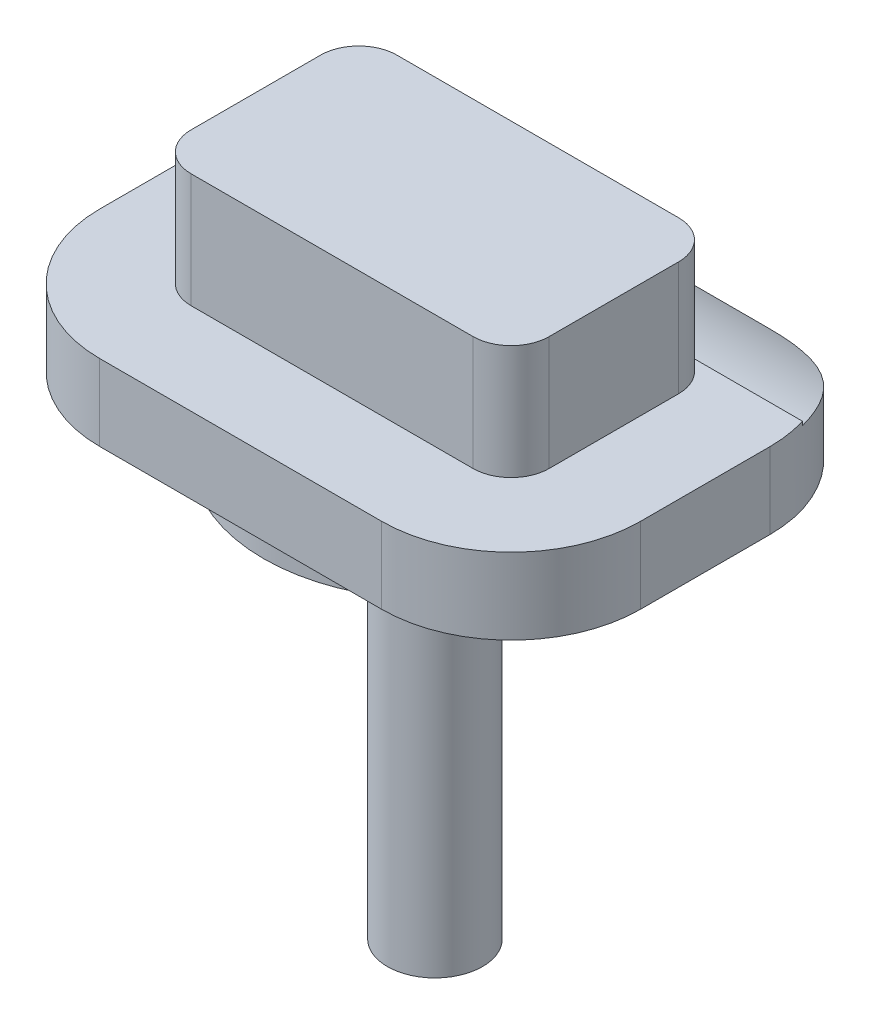
ISO-10303-21;
HEADER;
FILE_DESCRIPTION(('STEP AP214'),'2;1');
FILE_NAME('part.step','',(''),(''),'','','');
FILE_SCHEMA(('AUTOMOTIVE_DESIGN { 1 0 10303 214 1 1 1 1 }'));
ENDSEC;
DATA;
#1=APPLICATION_CONTEXT('core data for automotive mechanical design processes');
#2=APPLICATION_PROTOCOL_DEFINITION('international standard','automotive_design',2000,#1);
#3=PRODUCT_CONTEXT('',#1,'mechanical');
#4=PRODUCT('Part','Part','',(#3));
#5=PRODUCT_RELATED_PRODUCT_CATEGORY('part','',(#4));
#6=PRODUCT_DEFINITION_FORMATION('','',#4);
#7=PRODUCT_DEFINITION_CONTEXT('part definition',#1,'design');
#8=PRODUCT_DEFINITION('design','',#6,#7);
#9=PRODUCT_DEFINITION_SHAPE('','',#8);
#10=(LENGTH_UNIT() NAMED_UNIT(*) SI_UNIT(.MILLI.,.METRE.));
#11=(NAMED_UNIT(*) PLANE_ANGLE_UNIT() SI_UNIT($,.RADIAN.));
#12=(NAMED_UNIT(*) SI_UNIT($,.STERADIAN.) SOLID_ANGLE_UNIT());
#13=UNCERTAINTY_MEASURE_WITH_UNIT(LENGTH_MEASURE(1.E-05),#10,'distance_accuracy_value','');
#14=(GEOMETRIC_REPRESENTATION_CONTEXT(3) GLOBAL_UNCERTAINTY_ASSIGNED_CONTEXT((#13)) GLOBAL_UNIT_ASSIGNED_CONTEXT((#10,
#11,#12)) REPRESENTATION_CONTEXT('',''));
#15=CARTESIAN_POINT('',(0.,0.,0.));
#16=DIRECTION('',(0.,0.,1.));
#17=DIRECTION('',(1.,0.,0.));
#18=AXIS2_PLACEMENT_3D('',#15,#16,#17);
#19=CARTESIAN_POINT('',(1.,-2.,-1.));
#20=DIRECTION('',(0.,-1.,0.));
#21=DIRECTION('',(0.,0.,-1.));
#22=AXIS2_PLACEMENT_3D('',#19,#20,#21);
#23=PLANE('',#22);
#24=CARTESIAN_POINT('',(1.,-2.,-1.));
#25=DIRECTION('',(0.,-1.,0.));
#26=DIRECTION('',(0.,0.,-1.));
#27=AXIS2_PLACEMENT_3D('',#24,#25,#26);
#28=CIRCLE('',#27,3.4);
#29=CARTESIAN_POINT('',(1.,-2.,2.4));
#30=VERTEX_POINT('',#29);
#31=CARTESIAN_POINT('',(-2.4,-2.,-1.));
#32=VERTEX_POINT('',#31);
#33=EDGE_CURVE('E229',#30,#32,#28,.T.);
#34=ORIENTED_EDGE('',*,*,#33,.T.);
#35=DIRECTION('',(0.,0.,-1.));
#36=VECTOR('',#35,1.);
#37=CARTESIAN_POINT('',(-2.4,-2.,-4.4));
#38=LINE('',#37,#36);
#39=CARTESIAN_POINT('',(-2.4,-2.,-4.4));
#40=VERTEX_POINT('',#39);
#41=EDGE_CURVE('E398',#32,#40,#38,.T.);
#42=ORIENTED_EDGE('',*,*,#41,.T.);
#43=CARTESIAN_POINT('',(1.,-2.,-4.4));
#44=DIRECTION('',(0.,-1.,0.));
#45=DIRECTION('',(0.,0.,1.));
#46=AXIS2_PLACEMENT_3D('',#43,#44,#45);
#47=CIRCLE('',#46,3.4);
#48=CARTESIAN_POINT('',(1.,-2.,-7.8));
#49=VERTEX_POINT('',#48);
#50=EDGE_CURVE('E397',#40,#49,#47,.T.);
#51=ORIENTED_EDGE('',*,*,#50,.T.);
#52=DIRECTION('',(1.,0.,0.));
#53=VECTOR('',#52,1.);
#54=CARTESIAN_POINT('',(1.,-2.,-7.8));
#55=LINE('',#54,#53);
#56=CARTESIAN_POINT('',(8.4,-2.,-7.8));
#57=VERTEX_POINT('',#56);
#58=EDGE_CURVE('E396',#49,#57,#55,.T.);
#59=ORIENTED_EDGE('',*,*,#58,.T.);
#60=CARTESIAN_POINT('',(8.4,-2.,-4.4));
#61=DIRECTION('',(0.,-1.,0.));
#62=DIRECTION('',(0.,0.,1.));
#63=AXIS2_PLACEMENT_3D('',#60,#61,#62);
#64=CIRCLE('',#63,3.4);
#65=CARTESIAN_POINT('',(11.8,-2.,-4.4));
#66=VERTEX_POINT('',#65);
#67=EDGE_CURVE('E400',#57,#66,#64,.T.);
#68=ORIENTED_EDGE('',*,*,#67,.T.);
#69=DIRECTION('',(0.,0.,1.));
#70=VECTOR('',#69,1.);
#71=CARTESIAN_POINT('',(11.8,-2.,-4.4));
#72=LINE('',#71,#70);
#73=CARTESIAN_POINT('',(11.8,-2.,-1.));
#74=VERTEX_POINT('',#73);
#75=EDGE_CURVE('E404',#66,#74,#72,.T.);
#76=ORIENTED_EDGE('',*,*,#75,.T.);
#77=CARTESIAN_POINT('',(8.4,-2.,-1.));
#78=DIRECTION('',(0.,-1.,0.));
#79=DIRECTION('',(0.,0.,1.));
#80=AXIS2_PLACEMENT_3D('',#77,#78,#79);
#81=CIRCLE('',#80,3.4);
#82=CARTESIAN_POINT('',(8.4,-2.,2.4));
#83=VERTEX_POINT('',#82);
#84=EDGE_CURVE('E406',#74,#83,#81,.T.);
#85=ORIENTED_EDGE('',*,*,#84,.T.);
#86=DIRECTION('',(-1.,0.,0.));
#87=VECTOR('',#86,1.);
#88=CARTESIAN_POINT('',(1.,-2.,2.4));
#89=LINE('',#88,#87);
#90=EDGE_CURVE('E358',#83,#30,#89,.T.);
#91=ORIENTED_EDGE('',*,*,#90,.T.);
#92=EDGE_LOOP('',(#34,#42,#51,#59,#68,#76,#85,#91));
#93=FACE_BOUND('',#92,.T.);
#94=CARTESIAN_POINT('',(4.7,-2.,-2.7));
#95=DIRECTION('',(0.,-1.,0.));
#96=DIRECTION('',(0.,0.,-1.));
#97=AXIS2_PLACEMENT_3D('',#94,#95,#96);
#98=CIRCLE('',#97,4.5);
#99=CARTESIAN_POINT('',(4.7,-2.,-7.2));
#100=VERTEX_POINT('',#99);
#101=EDGE_CURVE('E547',#100,#100,#98,.T.);
#102=ORIENTED_EDGE('',*,*,#101,.F.);
#103=EDGE_LOOP('',(#102));
#104=FACE_BOUND('',#103,.T.);
#105=ADVANCED_FACE('F45',(#93,#104),#23,.T.);
#106=CARTESIAN_POINT('',(8.4,3.,-4.4));
#107=DIRECTION('',(0.,-1.,0.));
#108=DIRECTION('',(0.,0.,-1.));
#109=AXIS2_PLACEMENT_3D('',#106,#107,#108);
#110=CYLINDRICAL_SURFACE('',#109,1.);
#111=CARTESIAN_POINT('',(8.4,0.,-4.4));
#112=DIRECTION('',(0.,1.,0.));
#113=DIRECTION('',(0.,0.,-1.));
#114=AXIS2_PLACEMENT_3D('',#111,#112,#113);
#115=CIRCLE('',#114,1.);
#116=CARTESIAN_POINT('',(9.4,0.,-4.4));
#117=VERTEX_POINT('',#116);
#118=CARTESIAN_POINT('',(8.4,0.,-5.4));
#119=VERTEX_POINT('',#118);
#120=EDGE_CURVE('E284',#117,#119,#115,.T.);
#121=ORIENTED_EDGE('',*,*,#120,.T.);
#122=DIRECTION('',(0.,-1.,0.));
#123=VECTOR('',#122,1.);
#124=CARTESIAN_POINT('',(8.4,3.,-5.4));
#125=LINE('',#124,#123);
#126=CARTESIAN_POINT('',(8.4,3.,-5.4));
#127=VERTEX_POINT('',#126);
#128=EDGE_CURVE('E286',#127,#119,#125,.T.);
#129=ORIENTED_EDGE('',*,*,#128,.F.);
#130=CARTESIAN_POINT('',(8.4,3.,-4.4));
#131=DIRECTION('',(0.,1.,0.));
#132=DIRECTION('',(0.,0.,-1.));
#133=AXIS2_PLACEMENT_3D('',#130,#131,#132);
#134=CIRCLE('',#133,1.);
#135=CARTESIAN_POINT('',(9.4,3.,-4.4));
#136=VERTEX_POINT('',#135);
#137=EDGE_CURVE('E315',#136,#127,#134,.T.);
#138=ORIENTED_EDGE('',*,*,#137,.F.);
#139=DIRECTION('',(0.,-1.,0.));
#140=VECTOR('',#139,1.);
#141=CARTESIAN_POINT('',(9.4,3.,-4.4));
#142=LINE('',#141,#140);
#143=EDGE_CURVE('E287',#136,#117,#142,.T.);
#144=ORIENTED_EDGE('',*,*,#143,.T.);
#145=EDGE_LOOP('',(#121,#129,#138,#144));
#146=FACE_BOUND('',#145,.T.);
#147=ADVANCED_FACE('F273',(#146),#110,.T.);
#148=CARTESIAN_POINT('',(1.,3.,-5.4));
#149=DIRECTION('',(0.,0.,1.));
#150=DIRECTION('',(1.,0.,0.));
#151=AXIS2_PLACEMENT_3D('',#148,#149,#150);
#152=PLANE('',#151);
#153=ORIENTED_EDGE('',*,*,#128,.T.);
#154=DIRECTION('',(-1.,0.,0.));
#155=VECTOR('',#154,1.);
#156=CARTESIAN_POINT('',(1.,0.,-5.4));
#157=LINE('',#156,#155);
#158=CARTESIAN_POINT('',(11.6496153618544,0.,-5.4));
#159=VERTEX_POINT('',#158);
#160=EDGE_CURVE('E177',#159,#119,#157,.T.);
#161=ORIENTED_EDGE('',*,*,#160,.F.);
#162=DIRECTION('',(0.,1.,0.));
#163=VECTOR('',#162,1.);
#164=CARTESIAN_POINT('',(11.6496153618544,-2.,-5.4));
#165=LINE('',#164,#163);
#166=CARTESIAN_POINT('',(11.6496153618544,-0.1,-5.4));
#167=VERTEX_POINT('',#166);
#168=EDGE_CURVE('E172',#167,#159,#165,.T.);
#169=ORIENTED_EDGE('',*,*,#168,.F.);
#170=DIRECTION('',(-1.,0.,0.));
#171=VECTOR('',#170,1.);
#172=CARTESIAN_POINT('',(11.8,-0.1,-5.4));
#173=LINE('',#172,#171);
#174=CARTESIAN_POINT('',(-2.24961536185438,-0.1,-5.4));
#175=VERTEX_POINT('',#174);
#176=EDGE_CURVE('E175',#167,#175,#173,.T.);
#177=ORIENTED_EDGE('',*,*,#176,.T.);
#178=DIRECTION('',(0.,1.,0.));
#179=VECTOR('',#178,1.);
#180=CARTESIAN_POINT('',(-2.24961536185438,-2.,-5.4));
#181=LINE('',#180,#179);
#182=CARTESIAN_POINT('',(-2.24961536185438,0.,-5.4));
#183=VERTEX_POINT('',#182);
#184=EDGE_CURVE('E61',#183,#175,#181,.F.);
#185=ORIENTED_EDGE('',*,*,#184,.F.);
#186=CARTESIAN_POINT('',(1.,0.,-5.4));
#187=VERTEX_POINT('',#186);
#188=EDGE_CURVE('E198',#187,#183,#157,.T.);
#189=ORIENTED_EDGE('',*,*,#188,.F.);
#190=DIRECTION('',(0.,-1.,0.));
#191=VECTOR('',#190,1.);
#192=CARTESIAN_POINT('',(1.,3.,-5.4));
#193=LINE('',#192,#191);
#194=CARTESIAN_POINT('',(1.,3.,-5.4));
#195=VERTEX_POINT('',#194);
#196=EDGE_CURVE('E332',#195,#187,#193,.T.);
#197=ORIENTED_EDGE('',*,*,#196,.F.);
#198=DIRECTION('',(-1.,0.,0.));
#199=VECTOR('',#198,1.);
#200=CARTESIAN_POINT('',(1.,3.,-5.4));
#201=LINE('',#200,#199);
#202=EDGE_CURVE('E373',#127,#195,#201,.T.);
#203=ORIENTED_EDGE('',*,*,#202,.F.);
#204=EDGE_LOOP('',(#153,#161,#169,#177,#185,#189,#197,#203));
#205=FACE_BOUND('',#204,.T.);
#206=ADVANCED_FACE('F174',(#205),#152,.F.);
#207=CARTESIAN_POINT('',(1.,3.,-4.4));
#208=DIRECTION('',(0.,-1.,0.));
#209=DIRECTION('',(0.,0.,-1.));
#210=AXIS2_PLACEMENT_3D('',#207,#208,#209);
#211=CYLINDRICAL_SURFACE('',#210,1.);
#212=CARTESIAN_POINT('',(1.,0.,-4.4));
#213=DIRECTION('',(0.,1.,0.));
#214=DIRECTION('',(0.,0.,-1.));
#215=AXIS2_PLACEMENT_3D('',#212,#213,#214);
#216=CIRCLE('',#215,1.);
#217=CARTESIAN_POINT('',(0.,0.,-4.4));
#218=VERTEX_POINT('',#217);
#219=EDGE_CURVE('E290',#187,#218,#216,.T.);
#220=ORIENTED_EDGE('',*,*,#219,.T.);
#221=DIRECTION('',(0.,-1.,0.));
#222=VECTOR('',#221,1.);
#223=CARTESIAN_POINT('',(0.,3.,-4.4));
#224=LINE('',#223,#222);
#225=CARTESIAN_POINT('',(0.,3.,-4.4));
#226=VERTEX_POINT('',#225);
#227=EDGE_CURVE('E329',#226,#218,#224,.T.);
#228=ORIENTED_EDGE('',*,*,#227,.F.);
#229=CARTESIAN_POINT('',(1.,3.,-4.4));
#230=DIRECTION('',(0.,1.,0.));
#231=DIRECTION('',(0.,0.,-1.));
#232=AXIS2_PLACEMENT_3D('',#229,#230,#231);
#233=CIRCLE('',#232,1.);
#234=EDGE_CURVE('E375',#195,#226,#233,.T.);
#235=ORIENTED_EDGE('',*,*,#234,.F.);
#236=ORIENTED_EDGE('',*,*,#196,.T.);
#237=EDGE_LOOP('',(#220,#228,#235,#236));
#238=FACE_BOUND('',#237,.T.);
#239=ADVANCED_FACE('F267',(#238),#211,.T.);
#240=CARTESIAN_POINT('',(0.,3.,-1.));
#241=DIRECTION('',(1.,0.,0.));
#242=DIRECTION('',(0.,0.,-1.));
#243=AXIS2_PLACEMENT_3D('',#240,#241,#242);
#244=PLANE('',#243);
#245=DIRECTION('',(0.,0.,1.));
#246=VECTOR('',#245,1.);
#247=CARTESIAN_POINT('',(0.,0.,-1.));
#248=LINE('',#247,#246);
#249=CARTESIAN_POINT('',(0.,0.,-1.));
#250=VERTEX_POINT('',#249);
#251=EDGE_CURVE('E294',#218,#250,#248,.T.);
#252=ORIENTED_EDGE('',*,*,#251,.T.);
#253=DIRECTION('',(0.,-1.,0.));
#254=VECTOR('',#253,1.);
#255=CARTESIAN_POINT('',(0.,3.,-1.));
#256=LINE('',#255,#254);
#257=CARTESIAN_POINT('',(0.,3.,-1.));
#258=VERTEX_POINT('',#257);
#259=EDGE_CURVE('E326',#258,#250,#256,.T.);
#260=ORIENTED_EDGE('',*,*,#259,.F.);
#261=DIRECTION('',(0.,0.,1.));
#262=VECTOR('',#261,1.);
#263=CARTESIAN_POINT('',(0.,3.,-1.));
#264=LINE('',#263,#262);
#265=EDGE_CURVE('E377',#226,#258,#264,.T.);
#266=ORIENTED_EDGE('',*,*,#265,.F.);
#267=ORIENTED_EDGE('',*,*,#227,.T.);
#268=EDGE_LOOP('',(#252,#260,#266,#267));
#269=FACE_BOUND('',#268,.T.);
#270=ADVANCED_FACE('F263',(#269),#244,.F.);
#271=CARTESIAN_POINT('',(1.,3.,-1.));
#272=DIRECTION('',(0.,-1.,0.));
#273=DIRECTION('',(0.,0.,-1.));
#274=AXIS2_PLACEMENT_3D('',#271,#272,#273);
#275=CYLINDRICAL_SURFACE('',#274,1.);
#276=CARTESIAN_POINT('',(1.,0.,-1.));
#277=DIRECTION('',(0.,1.,0.));
#278=DIRECTION('',(0.,0.,-1.));
#279=AXIS2_PLACEMENT_3D('',#276,#277,#278);
#280=CIRCLE('',#279,1.);
#281=CARTESIAN_POINT('',(1.,0.,0.));
#282=VERTEX_POINT('',#281);
#283=EDGE_CURVE('E304',#250,#282,#280,.T.);
#284=ORIENTED_EDGE('',*,*,#283,.T.);
#285=DIRECTION('',(0.,-1.,0.));
#286=VECTOR('',#285,1.);
#287=CARTESIAN_POINT('',(1.,3.,0.));
#288=LINE('',#287,#286);
#289=CARTESIAN_POINT('',(1.,3.,0.));
#290=VERTEX_POINT('',#289);
#291=EDGE_CURVE('E323',#290,#282,#288,.T.);
#292=ORIENTED_EDGE('',*,*,#291,.F.);
#293=CARTESIAN_POINT('',(1.,3.,-1.));
#294=DIRECTION('',(0.,1.,0.));
#295=DIRECTION('',(0.,0.,-1.));
#296=AXIS2_PLACEMENT_3D('',#293,#294,#295);
#297=CIRCLE('',#296,1.);
#298=EDGE_CURVE('E379',#258,#290,#297,.T.);
#299=ORIENTED_EDGE('',*,*,#298,.F.);
#300=ORIENTED_EDGE('',*,*,#259,.T.);
#301=EDGE_LOOP('',(#284,#292,#299,#300));
#302=FACE_BOUND('',#301,.T.);
#303=ADVANCED_FACE('F259',(#302),#275,.T.);
#304=CARTESIAN_POINT('',(1.,3.,0.));
#305=DIRECTION('',(0.,0.,-1.));
#306=DIRECTION('',(-1.,0.,0.));
#307=AXIS2_PLACEMENT_3D('',#304,#305,#306);
#308=PLANE('',#307);
#309=DIRECTION('',(1.,0.,0.));
#310=VECTOR('',#309,1.);
#311=CARTESIAN_POINT('',(1.,0.,0.));
#312=LINE('',#311,#310);
#313=CARTESIAN_POINT('',(8.4,0.,0.));
#314=VERTEX_POINT('',#313);
#315=EDGE_CURVE('E307',#282,#314,#312,.T.);
#316=ORIENTED_EDGE('',*,*,#315,.T.);
#317=DIRECTION('',(0.,-1.,0.));
#318=VECTOR('',#317,1.);
#319=CARTESIAN_POINT('',(8.4,3.,0.));
#320=LINE('',#319,#318);
#321=CARTESIAN_POINT('',(8.4,3.,0.));
#322=VERTEX_POINT('',#321);
#323=EDGE_CURVE('E320',#322,#314,#320,.T.);
#324=ORIENTED_EDGE('',*,*,#323,.F.);
#325=DIRECTION('',(1.,0.,0.));
#326=VECTOR('',#325,1.);
#327=CARTESIAN_POINT('',(1.,3.,0.));
#328=LINE('',#327,#326);
#329=EDGE_CURVE('E381',#290,#322,#328,.T.);
#330=ORIENTED_EDGE('',*,*,#329,.F.);
#331=ORIENTED_EDGE('',*,*,#291,.T.);
#332=EDGE_LOOP('',(#316,#324,#330,#331));
#333=FACE_BOUND('',#332,.T.);
#334=ADVANCED_FACE('F255',(#333),#308,.F.);
#335=CARTESIAN_POINT('',(8.4,3.,-1.));
#336=DIRECTION('',(0.,-1.,0.));
#337=DIRECTION('',(0.,0.,-1.));
#338=AXIS2_PLACEMENT_3D('',#335,#336,#337);
#339=CYLINDRICAL_SURFACE('',#338,1.);
#340=CARTESIAN_POINT('',(8.4,0.,-1.));
#341=DIRECTION('',(0.,1.,0.));
#342=DIRECTION('',(0.,0.,-1.));
#343=AXIS2_PLACEMENT_3D('',#340,#341,#342);
#344=CIRCLE('',#343,1.);
#345=CARTESIAN_POINT('',(9.4,0.,-1.));
#346=VERTEX_POINT('',#345);
#347=EDGE_CURVE('E310',#314,#346,#344,.T.);
#348=ORIENTED_EDGE('',*,*,#347,.T.);
#349=DIRECTION('',(0.,-1.,0.));
#350=VECTOR('',#349,1.);
#351=CARTESIAN_POINT('',(9.4,3.,-1.));
#352=LINE('',#351,#350);
#353=CARTESIAN_POINT('',(9.4,3.,-1.));
#354=VERTEX_POINT('',#353);
#355=EDGE_CURVE('E317',#354,#346,#352,.T.);
#356=ORIENTED_EDGE('',*,*,#355,.F.);
#357=CARTESIAN_POINT('',(8.4,3.,-1.));
#358=DIRECTION('',(0.,1.,0.));
#359=DIRECTION('',(0.,0.,-1.));
#360=AXIS2_PLACEMENT_3D('',#357,#358,#359);
#361=CIRCLE('',#360,1.);
#362=EDGE_CURVE('E382',#322,#354,#361,.T.);
#363=ORIENTED_EDGE('',*,*,#362,.F.);
#364=ORIENTED_EDGE('',*,*,#323,.T.);
#365=EDGE_LOOP('',(#348,#356,#363,#364));
#366=FACE_BOUND('',#365,.T.);
#367=ADVANCED_FACE('F251',(#366),#339,.T.);
#368=CARTESIAN_POINT('',(9.4,3.,-1.));
#369=DIRECTION('',(-1.,0.,0.));
#370=DIRECTION('',(0.,0.,1.));
#371=AXIS2_PLACEMENT_3D('',#368,#369,#370);
#372=PLANE('',#371);
#373=DIRECTION('',(0.,0.,-1.));
#374=VECTOR('',#373,1.);
#375=CARTESIAN_POINT('',(9.4,0.,-1.));
#376=LINE('',#375,#374);
#377=EDGE_CURVE('E313',#346,#117,#376,.T.);
#378=ORIENTED_EDGE('',*,*,#377,.T.);
#379=ORIENTED_EDGE('',*,*,#143,.F.);
#380=DIRECTION('',(0.,0.,-1.));
#381=VECTOR('',#380,1.);
#382=CARTESIAN_POINT('',(9.4,3.,-1.));
#383=LINE('',#382,#381);
#384=EDGE_CURVE('E69',#354,#136,#383,.T.);
#385=ORIENTED_EDGE('',*,*,#384,.F.);
#386=ORIENTED_EDGE('',*,*,#355,.T.);
#387=EDGE_LOOP('',(#378,#379,#385,#386));
#388=FACE_BOUND('',#387,.T.);
#389=ADVANCED_FACE('F248',(#388),#372,.F.);
#390=CARTESIAN_POINT('',(8.4,3.,-4.4));
#391=DIRECTION('',(0.,-1.,0.));
#392=DIRECTION('',(0.,0.,-1.));
#393=AXIS2_PLACEMENT_3D('',#390,#391,#392);
#394=PLANE('',#393);
#395=ORIENTED_EDGE('',*,*,#137,.T.);
#396=ORIENTED_EDGE('',*,*,#202,.T.);
#397=ORIENTED_EDGE('',*,*,#234,.T.);
#398=ORIENTED_EDGE('',*,*,#265,.T.);
#399=ORIENTED_EDGE('',*,*,#298,.T.);
#400=ORIENTED_EDGE('',*,*,#329,.T.);
#401=ORIENTED_EDGE('',*,*,#362,.T.);
#402=ORIENTED_EDGE('',*,*,#384,.T.);
#403=EDGE_LOOP('',(#395,#396,#397,#398,#399,#400,#401,#402));
#404=FACE_BOUND('',#403,.T.);
#405=ADVANCED_FACE('F244',(#404),#394,.F.);
#406=CARTESIAN_POINT('',(1.,-2.,-1.));
#407=DIRECTION('',(0.,1.,0.));
#408=DIRECTION('',(0.,0.,1.));
#409=AXIS2_PLACEMENT_3D('',#406,#407,#408);
#410=CYLINDRICAL_SURFACE('',#409,3.4);
#411=CARTESIAN_POINT('',(1.,0.,-1.));
#412=DIRECTION('',(0.,-1.,0.));
#413=DIRECTION('',(0.,0.,-1.));
#414=AXIS2_PLACEMENT_3D('',#411,#412,#413);
#415=CIRCLE('',#414,3.4);
#416=CARTESIAN_POINT('',(1.,0.,2.4));
#417=VERTEX_POINT('',#416);
#418=CARTESIAN_POINT('',(-2.4,0.,-1.));
#419=VERTEX_POINT('',#418);
#420=EDGE_CURVE('E228',#417,#419,#415,.T.);
#421=ORIENTED_EDGE('',*,*,#420,.T.);
#422=DIRECTION('',(0.,1.,0.));
#423=VECTOR('',#422,1.);
#424=CARTESIAN_POINT('',(-2.4,-2.,-1.));
#425=LINE('',#424,#423);
#426=EDGE_CURVE('E291',#32,#419,#425,.T.);
#427=ORIENTED_EDGE('',*,*,#426,.F.);
#428=ORIENTED_EDGE('',*,*,#33,.F.);
#429=DIRECTION('',(0.,1.,0.));
#430=VECTOR('',#429,1.);
#431=CARTESIAN_POINT('',(1.,-2.,2.4));
#432=LINE('',#431,#430);
#433=EDGE_CURVE('E354',#30,#417,#432,.T.);
#434=ORIENTED_EDGE('',*,*,#433,.T.);
#435=EDGE_LOOP('',(#421,#427,#428,#434));
#436=FACE_BOUND('',#435,.T.);
#437=ADVANCED_FACE('F240',(#436),#410,.T.);
#438=CARTESIAN_POINT('',(-2.4,-2.,-4.4));
#439=DIRECTION('',(1.,0.,0.));
#440=DIRECTION('',(0.,0.,-1.));
#441=AXIS2_PLACEMENT_3D('',#438,#439,#440);
#442=PLANE('',#441);
#443=DIRECTION('',(0.,0.,-1.));
#444=VECTOR('',#443,1.);
#445=CARTESIAN_POINT('',(-2.4,0.,-4.4));
#446=LINE('',#445,#444);
#447=CARTESIAN_POINT('',(-2.4,0.,-4.4));
#448=VERTEX_POINT('',#447);
#449=EDGE_CURVE('E342',#419,#448,#446,.T.);
#450=ORIENTED_EDGE('',*,*,#449,.T.);
#451=DIRECTION('',(0.,1.,0.));
#452=VECTOR('',#451,1.);
#453=CARTESIAN_POINT('',(-2.4,-2.,-4.4));
#454=LINE('',#453,#452);
#455=EDGE_CURVE('E297',#40,#448,#454,.T.);
#456=ORIENTED_EDGE('',*,*,#455,.F.);
#457=ORIENTED_EDGE('',*,*,#41,.F.);
#458=ORIENTED_EDGE('',*,*,#426,.T.);
#459=EDGE_LOOP('',(#450,#456,#457,#458));
#460=FACE_BOUND('',#459,.T.);
#461=ADVANCED_FACE('F236',(#460),#442,.F.);
#462=CARTESIAN_POINT('',(1.,-2.,-4.4));
#463=DIRECTION('',(0.,1.,0.));
#464=DIRECTION('',(0.,0.,1.));
#465=AXIS2_PLACEMENT_3D('',#462,#463,#464);
#466=CYLINDRICAL_SURFACE('',#465,3.4);
#467=ORIENTED_EDGE('',*,*,#184,.T.);
#468=CARTESIAN_POINT('',(-2.24961536185438,-0.1,-5.4));
#469=CARTESIAN_POINT('',(-2.22211612293551,-0.104930020868707,-5.48940473327464));
#470=CARTESIAN_POINT('',(-2.19094108372185,-0.11176038520616,-5.57754640562647));
#471=CARTESIAN_POINT('',(-2.12160757579892,-0.12878055348064,-5.75064058396433));
#472=CARTESIAN_POINT('',(-2.08345362720583,-0.138968186378186,-5.83559511153468));
#473=CARTESIAN_POINT('',(-2.0006636122125,-0.162221517291019,-6.00142934095505));
#474=CARTESIAN_POINT('',(-1.95605467621567,-0.175275282187592,-6.0823242779127));
#475=CARTESIAN_POINT('',(-1.86063444208582,-0.203775137997483,-6.23990906244186));
#476=CARTESIAN_POINT('',(-1.80982224662768,-0.219221575107039,-6.31659829931206));
#477=CARTESIAN_POINT('',(-1.64889180855043,-0.268279448028438,-6.53934960962807));
#478=CARTESIAN_POINT('',(-1.53001740696857,-0.304688331875978,-6.67861692877784));
#479=CARTESIAN_POINT('',(-1.27193773877062,-0.380406348904339,-6.93607175532186));
#480=CARTESIAN_POINT('',(-1.13270171734646,-0.419719824020911,-7.05422676336907));
#481=CARTESIAN_POINT('',(-0.827362517686092,-0.498854142322283,-7.27370315082503));
#482=CARTESIAN_POINT('',(-0.660124847185661,-0.538553506217247,-7.37351360079621));
#483=CARTESIAN_POINT('',(-0.397624279200134,-0.592093603259825,-7.50098904425838));
#484=CARTESIAN_POINT('',(-0.308205212954567,-0.608935642664759,-7.53976781991152));
#485=CARTESIAN_POINT('',(-0.125979333357175,-0.63996626428554,-7.60962156933163));
#486=CARTESIAN_POINT('',(-0.0331745249510966,-0.654156387362837,-7.64070102013064));
#487=CARTESIAN_POINT('',(0.136684991607721,-0.676810780281716,-7.68951292731177));
#488=CARTESIAN_POINT('',(0.213258557333504,-0.685852212813921,-7.70866761336767));
#489=CARTESIAN_POINT('',(0.367778016031733,-0.701565540709544,-7.74163634921494));
#490=CARTESIAN_POINT('',(0.445723629384494,-0.708237913145149,-7.7554514743162));
#491=CARTESIAN_POINT('',(0.602794068153814,-0.719019643131092,-7.77765193027795));
#492=CARTESIAN_POINT('',(0.68192166816964,-0.723121474528327,-7.7860213195659));
#493=CARTESIAN_POINT('',(0.840697304581715,-0.72861997115981,-7.7972011720851));
#494=CARTESIAN_POINT('',(0.92034556100424,-0.730015407055184,-7.80000910912378));
#495=CARTESIAN_POINT('',(1.,-0.73,-7.8));
#496=B_SPLINE_CURVE_WITH_KNOTS('',3,(#468,#469,#470,#471,#472,#473,#474,#475,#476,#477,#478,
#479,#480,#481,#482,#483,#484,#485,#486,#487,#488,#489,#490,#491,#492,#493,#494,#495),
.UNSPECIFIED.,.F.,.F.,(4,2,2,2,2,2,2,2,2,2,2,2,2,4),(0.,0.280866110470934,0.561550948950454,
0.84108860036833,1.12066673599235,1.67807696880958,2.23633799745521,2.82944235879017,
3.12585886693878,3.42210260699166,3.66023991487992,3.89832924036022,4.13711243774232,
4.37600407337005),.UNSPECIFIED.);
#497=CARTESIAN_POINT('',(0.999999999999999,-0.73,-7.8));
#498=VERTEX_POINT('',#497);
#499=EDGE_CURVE('E188',#175,#498,#496,.T.);
#500=ORIENTED_EDGE('',*,*,#499,.T.);
#501=DIRECTION('',(0.,1.,0.));
#502=VECTOR('',#501,1.);
#503=CARTESIAN_POINT('',(1.,-2.,-7.8));
#504=LINE('',#503,#502);
#505=EDGE_CURVE('E368',#49,#498,#504,.T.);
#506=ORIENTED_EDGE('',*,*,#505,.F.);
#507=ORIENTED_EDGE('',*,*,#50,.F.);
#508=ORIENTED_EDGE('',*,*,#455,.T.);
#509=CARTESIAN_POINT('',(1.,0.,-4.4));
#510=DIRECTION('',(0.,-1.,0.));
#511=DIRECTION('',(0.,0.,1.));
#512=AXIS2_PLACEMENT_3D('',#509,#510,#511);
#513=CIRCLE('',#512,3.4);
#514=EDGE_CURVE('E336',#448,#183,#513,.T.);
#515=ORIENTED_EDGE('',*,*,#514,.T.);
#516=EDGE_LOOP('',(#467,#500,#506,#507,#508,#515));
#517=FACE_BOUND('',#516,.T.);
#518=ADVANCED_FACE('F231',(#517),#466,.T.);
#519=CARTESIAN_POINT('',(1.,-2.,-7.8));
#520=DIRECTION('',(0.,0.,1.));
#521=DIRECTION('',(1.,0.,0.));
#522=AXIS2_PLACEMENT_3D('',#519,#520,#521);
#523=PLANE('',#522);
#524=ORIENTED_EDGE('',*,*,#505,.T.);
#525=DIRECTION('',(-1.,0.,0.));
#526=VECTOR('',#525,1.);
#527=CARTESIAN_POINT('',(11.8,-0.73,-7.8));
#528=LINE('',#527,#526);
#529=CARTESIAN_POINT('',(8.4,-0.73,-7.8));
#530=VERTEX_POINT('',#529);
#531=EDGE_CURVE('E181',#530,#498,#528,.T.);
#532=ORIENTED_EDGE('',*,*,#531,.F.);
#533=DIRECTION('',(0.,1.,0.));
#534=VECTOR('',#533,1.);
#535=CARTESIAN_POINT('',(8.4,-2.,-7.8));
#536=LINE('',#535,#534);
#537=EDGE_CURVE('E195',#57,#530,#536,.T.);
#538=ORIENTED_EDGE('',*,*,#537,.F.);
#539=ORIENTED_EDGE('',*,*,#58,.F.);
#540=EDGE_LOOP('',(#524,#532,#538,#539));
#541=FACE_BOUND('',#540,.T.);
#542=ADVANCED_FACE('F235',(#541),#523,.F.);
#543=CARTESIAN_POINT('',(8.4,-2.,-4.4));
#544=DIRECTION('',(0.,1.,0.));
#545=DIRECTION('',(0.,0.,1.));
#546=AXIS2_PLACEMENT_3D('',#543,#544,#545);
#547=CYLINDRICAL_SURFACE('',#546,3.4);
#548=ORIENTED_EDGE('',*,*,#537,.T.);
#549=CARTESIAN_POINT('',(8.4,-0.73,-7.8));
#550=CARTESIAN_POINT('',(8.49092934202292,-0.730025507036669,-7.80001472124607));
#551=CARTESIAN_POINT('',(8.58184569862225,-0.728201658790307,-7.79635276502458));
#552=CARTESIAN_POINT('',(8.76291242593846,-0.721046239572221,-7.78179142163702));
#553=CARTESIAN_POINT('',(8.85306316770618,-0.715716479118828,-7.77089577005896));
#554=CARTESIAN_POINT('',(9.03150893412945,-0.701774625098066,-7.74205466249723));
#555=CARTESIAN_POINT('',(9.1198109596608,-0.693178992949787,-7.72414454874349));
#556=CARTESIAN_POINT('',(9.29438827716181,-0.67305656008713,-7.68148644501485));
#557=CARTESIAN_POINT('',(9.38066337926189,-0.661529485959995,-7.6567378171997));
#558=CARTESIAN_POINT('',(9.63530203246961,-0.62321827012577,-7.57267762534011));
#559=CARTESIAN_POINT('',(9.7999475984356,-0.592663850433915,-7.50347466535075));
#560=CARTESIAN_POINT('',(10.1156027374087,-0.525562293880312,-7.34080745911131));
#561=CARTESIAN_POINT('',(10.2665897080879,-0.489005495763115,-7.24730395562263));
#562=CARTESIAN_POINT('',(10.5614763694485,-0.411860013268046,-7.03127444541872));
#563=CARTESIAN_POINT('',(10.7042401766213,-0.371164776757679,-6.90723384701366));
#564=CARTESIAN_POINT('',(10.9676355190216,-0.293342293583697,-6.63669147123384));
#565=CARTESIAN_POINT('',(11.0882932681077,-0.256210846117776,-6.49021668041993));
#566=CARTESIAN_POINT('',(11.2452098949064,-0.208477359939807,-6.26339025927213));
#567=CARTESIAN_POINT('',(11.2915906770497,-0.194456745407308,-6.19058179605371));
#568=CARTESIAN_POINT('',(11.3788317014324,-0.168605733709888,-6.0413478508832));
#569=CARTESIAN_POINT('',(11.4196929818092,-0.156774924519282,-5.96492305277224));
#570=CARTESIAN_POINT('',(11.4956847830533,-0.135686116174591,-5.80865305004315));
#571=CARTESIAN_POINT('',(11.5307983151678,-0.126435689133392,-5.72879855605635));
#572=CARTESIAN_POINT('',(11.5948893245999,-0.110901094571797,-5.56633188297545));
#573=CARTESIAN_POINT('',(11.6238631354046,-0.104618696758752,-5.48371808998054));
#574=CARTESIAN_POINT('',(11.6496153618544,-0.1,-5.4));
#575=B_SPLINE_CURVE_WITH_KNOTS('',3,(#549,#550,#551,#552,#553,#554,#555,#556,#557,#558,#559,
#560,#561,#562,#563,#564,#565,#566,#567,#568,#569,#570,#571,#572,#573,#574),.UNSPECIFIED.,.F.,
.F.,(4,2,2,2,2,2,2,2,2,2,2,2,4),(0.,0.272674630366256,0.54520855690986,0.816386635589567,
1.0875900160683,1.62858470352194,2.17045885367475,2.74830531217038,3.32546204857914,
3.58761467945053,3.84971793439759,4.11258242657535,4.37560345627262),.UNSPECIFIED.);
#576=EDGE_CURVE('E185',#530,#167,#575,.T.);
#577=ORIENTED_EDGE('',*,*,#576,.T.);
#578=ORIENTED_EDGE('',*,*,#168,.T.);
#579=CARTESIAN_POINT('',(8.4,0.,-4.4));
#580=DIRECTION('',(0.,-1.,0.));
#581=DIRECTION('',(0.,0.,1.));
#582=AXIS2_PLACEMENT_3D('',#579,#580,#581);
#583=CIRCLE('',#582,3.4);
#584=CARTESIAN_POINT('',(11.8,0.,-4.4));
#585=VERTEX_POINT('',#584);
#586=EDGE_CURVE('E341',#159,#585,#583,.T.);
#587=ORIENTED_EDGE('',*,*,#586,.T.);
#588=DIRECTION('',(0.,1.,0.));
#589=VECTOR('',#588,1.);
#590=CARTESIAN_POINT('',(11.8,-2.,-4.4));
#591=LINE('',#590,#589);
#592=EDGE_CURVE('E364',#66,#585,#591,.T.);
#593=ORIENTED_EDGE('',*,*,#592,.F.);
#594=ORIENTED_EDGE('',*,*,#67,.F.);
#595=EDGE_LOOP('',(#548,#577,#578,#587,#593,#594));
#596=FACE_BOUND('',#595,.T.);
#597=ADVANCED_FACE('F192',(#596),#547,.T.);
#598=CARTESIAN_POINT('',(11.8,-2.,-4.4));
#599=DIRECTION('',(-1.,0.,0.));
#600=DIRECTION('',(0.,0.,1.));
#601=AXIS2_PLACEMENT_3D('',#598,#599,#600);
#602=PLANE('',#601);
#603=DIRECTION('',(0.,0.,1.));
#604=VECTOR('',#603,1.);
#605=CARTESIAN_POINT('',(11.8,0.,-4.4));
#606=LINE('',#605,#604);
#607=CARTESIAN_POINT('',(11.8,0.,-1.));
#608=VERTEX_POINT('',#607);
#609=EDGE_CURVE('E344',#585,#608,#606,.T.);
#610=ORIENTED_EDGE('',*,*,#609,.T.);
#611=DIRECTION('',(0.,1.,0.));
#612=VECTOR('',#611,1.);
#613=CARTESIAN_POINT('',(11.8,-2.,-1.));
#614=LINE('',#613,#612);
#615=EDGE_CURVE('E361',#74,#608,#614,.T.);
#616=ORIENTED_EDGE('',*,*,#615,.F.);
#617=ORIENTED_EDGE('',*,*,#75,.F.);
#618=ORIENTED_EDGE('',*,*,#592,.T.);
#619=EDGE_LOOP('',(#610,#616,#617,#618));
#620=FACE_BOUND('',#619,.T.);
#621=ADVANCED_FACE('F427',(#620),#602,.F.);
#622=CARTESIAN_POINT('',(8.4,-2.,-1.));
#623=DIRECTION('',(0.,1.,0.));
#624=DIRECTION('',(0.,0.,1.));
#625=AXIS2_PLACEMENT_3D('',#622,#623,#624);
#626=CYLINDRICAL_SURFACE('',#625,3.4);
#627=CARTESIAN_POINT('',(8.4,0.,-1.));
#628=DIRECTION('',(0.,-1.,0.));
#629=DIRECTION('',(0.,0.,1.));
#630=AXIS2_PLACEMENT_3D('',#627,#628,#629);
#631=CIRCLE('',#630,3.4);
#632=CARTESIAN_POINT('',(8.4,0.,2.4));
#633=VERTEX_POINT('',#632);
#634=EDGE_CURVE('E350',#608,#633,#631,.T.);
#635=ORIENTED_EDGE('',*,*,#634,.T.);
#636=DIRECTION('',(0.,1.,0.));
#637=VECTOR('',#636,1.);
#638=CARTESIAN_POINT('',(8.4,-2.,2.4));
#639=LINE('',#638,#637);
#640=EDGE_CURVE('E357',#83,#633,#639,.T.);
#641=ORIENTED_EDGE('',*,*,#640,.F.);
#642=ORIENTED_EDGE('',*,*,#84,.F.);
#643=ORIENTED_EDGE('',*,*,#615,.T.);
#644=EDGE_LOOP('',(#635,#641,#642,#643));
#645=FACE_BOUND('',#644,.T.);
#646=ADVANCED_FACE('F423',(#645),#626,.T.);
#647=CARTESIAN_POINT('',(1.,-2.,2.4));
#648=DIRECTION('',(0.,0.,-1.));
#649=DIRECTION('',(-1.,0.,0.));
#650=AXIS2_PLACEMENT_3D('',#647,#648,#649);
#651=PLANE('',#650);
#652=DIRECTION('',(-1.,0.,0.));
#653=VECTOR('',#652,1.);
#654=CARTESIAN_POINT('',(1.,0.,2.4));
#655=LINE('',#654,#653);
#656=EDGE_CURVE('E352',#633,#417,#655,.T.);
#657=ORIENTED_EDGE('',*,*,#656,.T.);
#658=ORIENTED_EDGE('',*,*,#433,.F.);
#659=ORIENTED_EDGE('',*,*,#90,.F.);
#660=ORIENTED_EDGE('',*,*,#640,.T.);
#661=EDGE_LOOP('',(#657,#658,#659,#660));
#662=FACE_BOUND('',#661,.T.);
#663=ADVANCED_FACE('F421',(#662),#651,.F.);
#664=CARTESIAN_POINT('',(1.,0.,-1.));
#665=DIRECTION('',(0.,-1.,0.));
#666=DIRECTION('',(0.,0.,-1.));
#667=AXIS2_PLACEMENT_3D('',#664,#665,#666);
#668=PLANE('',#667);
#669=ORIENTED_EDGE('',*,*,#586,.F.);
#670=ORIENTED_EDGE('',*,*,#160,.T.);
#671=ORIENTED_EDGE('',*,*,#120,.F.);
#672=ORIENTED_EDGE('',*,*,#377,.F.);
#673=ORIENTED_EDGE('',*,*,#347,.F.);
#674=ORIENTED_EDGE('',*,*,#315,.F.);
#675=ORIENTED_EDGE('',*,*,#283,.F.);
#676=ORIENTED_EDGE('',*,*,#251,.F.);
#677=ORIENTED_EDGE('',*,*,#219,.F.);
#678=ORIENTED_EDGE('',*,*,#188,.T.);
#679=ORIENTED_EDGE('',*,*,#514,.F.);
#680=ORIENTED_EDGE('',*,*,#449,.F.);
#681=ORIENTED_EDGE('',*,*,#420,.F.);
#682=ORIENTED_EDGE('',*,*,#656,.F.);
#683=ORIENTED_EDGE('',*,*,#634,.F.);
#684=ORIENTED_EDGE('',*,*,#609,.F.);
#685=EDGE_LOOP('',(#669,#670,#671,#672,#673,#674,#675,#676,#677,#678,#679,#680,#681,#682,#683,#684));
#686=FACE_BOUND('',#685,.T.);
#687=ADVANCED_FACE('F215',(#686),#668,.F.);
#688=CARTESIAN_POINT('',(11.8,-6.29054200568311,-5.05767022350818));
#689=DIRECTION('',(-1.,0.,0.));
#690=DIRECTION('',(0.,0.,1.));
#691=AXIS2_PLACEMENT_3D('',#688,#689,#690);
#692=CYLINDRICAL_SURFACE('',#691,6.2);
#693=ORIENTED_EDGE('',*,*,#176,.F.);
#694=ORIENTED_EDGE('',*,*,#576,.F.);
#695=ORIENTED_EDGE('',*,*,#531,.T.);
#696=ORIENTED_EDGE('',*,*,#499,.F.);
#697=EDGE_LOOP('',(#693,#694,#695,#696));
#698=FACE_BOUND('',#697,.T.);
#699=ADVANCED_FACE('F184',(#698),#692,.T.);
#700=CARTESIAN_POINT('',(4.7,-3.,-2.7));
#701=DIRECTION('',(0.,-1.,0.));
#702=DIRECTION('',(0.,0.,-1.));
#703=AXIS2_PLACEMENT_3D('',#700,#701,#702);
#704=PLANE('',#703);
#705=CARTESIAN_POINT('',(4.7,-3.,-2.7));
#706=DIRECTION('',(0.,-1.,0.));
#707=DIRECTION('',(0.,0.,-1.));
#708=AXIS2_PLACEMENT_3D('',#705,#706,#707);
#709=CIRCLE('',#708,4.5);
#710=CARTESIAN_POINT('',(4.7,-3.,-7.2));
#711=VERTEX_POINT('',#710);
#712=EDGE_CURVE('E550',#711,#711,#709,.T.);
#713=ORIENTED_EDGE('',*,*,#712,.T.);
#714=EDGE_LOOP('',(#713));
#715=FACE_BOUND('',#714,.T.);
#716=CARTESIAN_POINT('',(4.7,-3.,-2.7));
#717=DIRECTION('',(0.,-1.,0.));
#718=DIRECTION('',(0.,0.,-1.));
#719=AXIS2_PLACEMENT_3D('',#716,#717,#718);
#720=CIRCLE('',#719,3.5);
#721=CARTESIAN_POINT('',(4.7,-3.,-6.2));
#722=VERTEX_POINT('',#721);
#723=EDGE_CURVE('E544',#722,#722,#720,.T.);
#724=ORIENTED_EDGE('',*,*,#723,.F.);
#725=EDGE_LOOP('',(#724));
#726=FACE_BOUND('',#725,.T.);
#727=ADVANCED_FACE('F214',(#715,#726),#704,.T.);
#728=CARTESIAN_POINT('',(4.7,-3.,-2.7));
#729=DIRECTION('',(0.,1.,0.));
#730=DIRECTION('',(0.,0.,1.));
#731=AXIS2_PLACEMENT_3D('',#728,#729,#730);
#732=CYLINDRICAL_SURFACE('',#731,4.5);
#733=ORIENTED_EDGE('',*,*,#712,.F.);
#734=EDGE_LOOP('',(#733));
#735=FACE_BOUND('',#734,.T.);
#736=ORIENTED_EDGE('',*,*,#101,.T.);
#737=EDGE_LOOP('',(#736));
#738=FACE_BOUND('',#737,.T.);
#739=ADVANCED_FACE('F483',(#735,#738),#732,.T.);
#740=CARTESIAN_POINT('',(4.7,-3.,-2.7));
#741=DIRECTION('',(0.,-1.,0.));
#742=DIRECTION('',(0.,0.,-1.));
#743=AXIS2_PLACEMENT_3D('',#740,#741,#742);
#744=PLANE('',#743);
#745=CARTESIAN_POINT('',(4.7,-3.,-2.7));
#746=DIRECTION('',(0.,-1.,0.));
#747=DIRECTION('',(0.,0.,-1.));
#748=AXIS2_PLACEMENT_3D('',#745,#746,#747);
#749=CIRCLE('',#748,2.25);
#750=CARTESIAN_POINT('',(4.7,-3.,-4.95));
#751=VERTEX_POINT('',#750);
#752=EDGE_CURVE('E11',#751,#751,#749,.F.);
#753=ORIENTED_EDGE('',*,*,#752,.T.);
#754=EDGE_LOOP('',(#753));
#755=FACE_BOUND('',#754,.T.);
#756=CARTESIAN_POINT('',(4.7,-3.,-2.7));
#757=DIRECTION('',(0.,-1.,0.));
#758=DIRECTION('',(0.,0.,-1.));
#759=AXIS2_PLACEMENT_3D('',#756,#757,#758);
#760=CIRCLE('',#759,2.65);
#761=CARTESIAN_POINT('',(4.7,-3.,-5.35));
#762=VERTEX_POINT('',#761);
#763=EDGE_CURVE('E553',#762,#762,#760,.T.);
#764=ORIENTED_EDGE('',*,*,#763,.T.);
#765=EDGE_LOOP('',(#764));
#766=FACE_BOUND('',#765,.T.);
#767=ADVANCED_FACE('F467',(#755,#766),#744,.T.);
#768=CARTESIAN_POINT('',(4.7,-1.,-2.7));
#769=DIRECTION('',(0.,-1.,0.));
#770=DIRECTION('',(0.,0.,-1.));
#771=AXIS2_PLACEMENT_3D('',#768,#769,#770);
#772=CYLINDRICAL_SURFACE('',#771,2.65);
#773=CARTESIAN_POINT('',(4.7,-1.,-2.7));
#774=DIRECTION('',(0.,-1.,0.));
#775=DIRECTION('',(0.,0.,-1.));
#776=AXIS2_PLACEMENT_3D('',#773,#774,#775);
#777=CIRCLE('',#776,2.65);
#778=CARTESIAN_POINT('',(4.7,-1.,-5.35));
#779=VERTEX_POINT('',#778);
#780=EDGE_CURVE('E558',#779,#779,#777,.T.);
#781=ORIENTED_EDGE('',*,*,#780,.T.);
#782=EDGE_LOOP('',(#781));
#783=FACE_BOUND('',#782,.T.);
#784=ORIENTED_EDGE('',*,*,#763,.F.);
#785=EDGE_LOOP('',(#784));
#786=FACE_BOUND('',#785,.T.);
#787=ADVANCED_FACE('F459',(#783,#786),#772,.T.);
#788=CARTESIAN_POINT('',(4.7,-1.,-2.7));
#789=DIRECTION('',(0.,-1.,0.));
#790=DIRECTION('',(0.,0.,-1.));
#791=AXIS2_PLACEMENT_3D('',#788,#789,#790);
#792=PLANE('',#791);
#793=ORIENTED_EDGE('',*,*,#780,.F.);
#794=EDGE_LOOP('',(#793));
#795=FACE_BOUND('',#794,.T.);
#796=CARTESIAN_POINT('',(4.7,-1.,-2.7));
#797=DIRECTION('',(0.,-1.,0.));
#798=DIRECTION('',(0.,0.,-1.));
#799=AXIS2_PLACEMENT_3D('',#796,#797,#798);
#800=CIRCLE('',#799,3.5);
#801=CARTESIAN_POINT('',(4.7,-1.,-6.2));
#802=VERTEX_POINT('',#801);
#803=EDGE_CURVE('E189',#802,#802,#800,.T.);
#804=ORIENTED_EDGE('',*,*,#803,.T.);
#805=EDGE_LOOP('',(#804));
#806=FACE_BOUND('',#805,.T.);
#807=ADVANCED_FACE('F455',(#795,#806),#792,.T.);
#808=CARTESIAN_POINT('',(4.7,-1.,-2.7));
#809=DIRECTION('',(0.,-1.,0.));
#810=DIRECTION('',(0.,0.,-1.));
#811=AXIS2_PLACEMENT_3D('',#808,#809,#810);
#812=CYLINDRICAL_SURFACE('',#811,3.5);
#813=ORIENTED_EDGE('',*,*,#803,.F.);
#814=EDGE_LOOP('',(#813));
#815=FACE_BOUND('',#814,.T.);
#816=ORIENTED_EDGE('',*,*,#723,.T.);
#817=EDGE_LOOP('',(#816));
#818=FACE_BOUND('',#817,.T.);
#819=ADVANCED_FACE('F216',(#815,#818),#812,.F.);
#820=CARTESIAN_POINT('',(4.7,-17.4355339059328,-2.7));
#821=DIRECTION('',(0.,1.,0.));
#822=DIRECTION('',(0.,0.,1.));
#823=AXIS2_PLACEMENT_3D('',#820,#821,#822);
#824=CYLINDRICAL_SURFACE('',#823,1.25);
#825=CARTESIAN_POINT('',(4.7,-4.00000000000001,-2.7));
#826=DIRECTION('',(0.,-1.,0.));
#827=DIRECTION('',(0.,0.,-1.));
#828=AXIS2_PLACEMENT_3D('',#825,#826,#827);
#829=CIRCLE('',#828,1.25);
#830=CARTESIAN_POINT('',(4.7,-4.00000000000001,-3.95));
#831=VERTEX_POINT('',#830);
#832=EDGE_CURVE('E54',#831,#831,#829,.T.);
#833=ORIENTED_EDGE('',*,*,#832,.T.);
#834=EDGE_LOOP('',(#833));
#835=FACE_BOUND('',#834,.T.);
#836=CARTESIAN_POINT('',(4.7,-13.9,-2.7));
#837=DIRECTION('',(0.,-1.,0.));
#838=DIRECTION('',(0.,0.,-1.));
#839=AXIS2_PLACEMENT_3D('',#836,#837,#838);
#840=CIRCLE('',#839,1.25);
#841=CARTESIAN_POINT('',(4.7,-13.9,-3.95));
#842=VERTEX_POINT('',#841);
#843=EDGE_CURVE('E543',#842,#842,#840,.T.);
#844=ORIENTED_EDGE('',*,*,#843,.F.);
#845=EDGE_LOOP('',(#844));
#846=FACE_BOUND('',#845,.T.);
#847=ADVANCED_FACE('F499',(#835,#846),#824,.T.);
#848=CARTESIAN_POINT('',(-11.,-13.9,4.89999999999994));
#849=DIRECTION('',(0.,-1.,0.));
#850=DIRECTION('',(-1.,0.,0.));
#851=AXIS2_PLACEMENT_3D('',#848,#849,#850);
#852=PLANE('',#851);
#853=ORIENTED_EDGE('',*,*,#843,.T.);
#854=EDGE_LOOP('',(#853));
#855=FACE_BOUND('',#854,.T.);
#856=ADVANCED_FACE('F504',(#855),#852,.T.);
#857=CARTESIAN_POINT('',(4.7,-4.00000000000001,-2.7));
#858=DIRECTION('',(0.,1.,0.));
#859=DIRECTION('',(0.,0.,1.));
#860=AXIS2_PLACEMENT_3D('',#857,#858,#859);
#861=CONICAL_SURFACE('',#860,1.25,0.785398163397442);
#862=ORIENTED_EDGE('',*,*,#752,.F.);
#863=EDGE_LOOP('',(#862));
#864=FACE_BOUND('',#863,.T.);
#865=ORIENTED_EDGE('',*,*,#832,.F.);
#866=EDGE_LOOP('',(#865));
#867=FACE_BOUND('',#866,.T.);
#868=ADVANCED_FACE('F48',(#864,#867),#861,.T.);
#869=CLOSED_SHELL('',(#105,#147,#206,#239,#270,#303,#334,#367,#389,#405,#437,#461,#518,#542,
#597,#621,#646,#663,#687,#699,#727,#739,#767,#787,#807,#819,#847,#856,#868));
#870=MANIFOLD_SOLID_BREP('B2',#869);
#871=ADVANCED_BREP_SHAPE_REPRESENTATION('',(#18,#870),#14);
#872=SHAPE_DEFINITION_REPRESENTATION(#9,#871);
ENDSEC;
END-ISO-10303-21;
